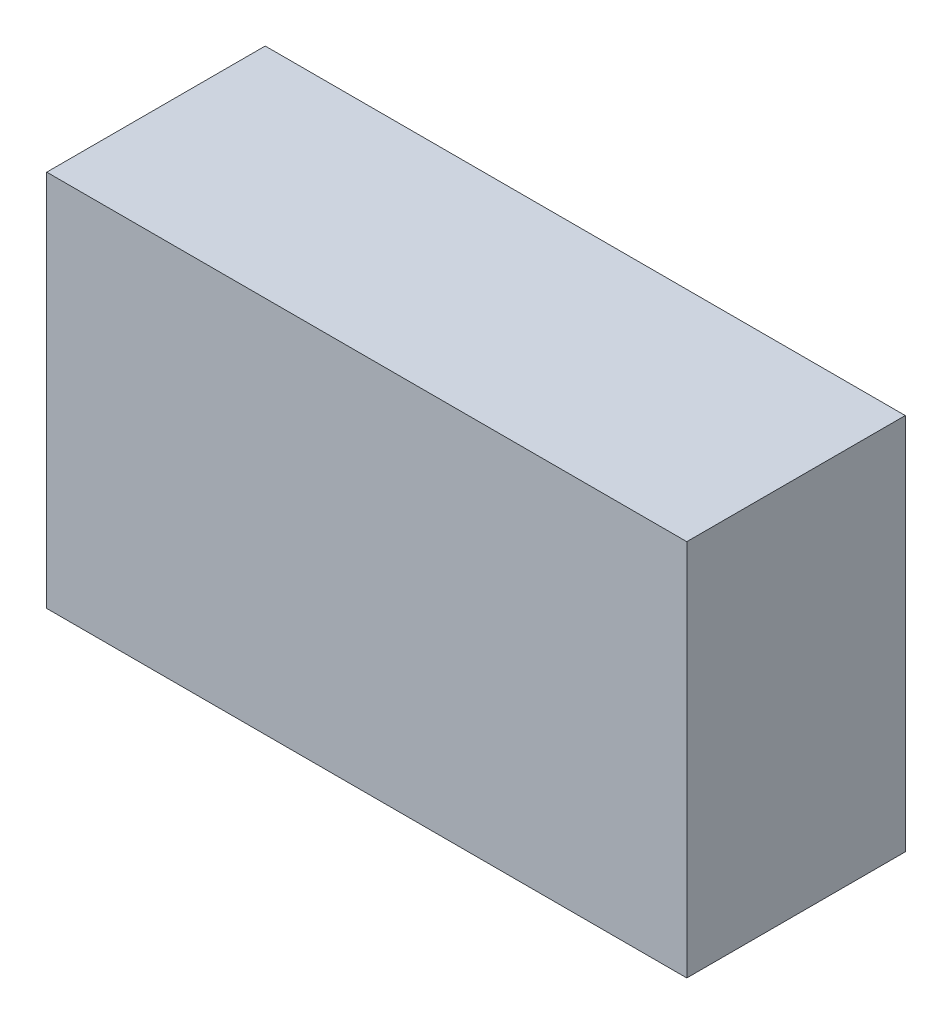
ISO-10303-21;
HEADER;
FILE_DESCRIPTION(('STEP AP214'),'2;1');
FILE_NAME('part.step','',(''),(''),'','','');
FILE_SCHEMA(('AUTOMOTIVE_DESIGN { 1 0 10303 214 1 1 1 1 }'));
ENDSEC;
DATA;
#1=APPLICATION_CONTEXT('core data for automotive mechanical design processes');
#2=APPLICATION_PROTOCOL_DEFINITION('international standard','automotive_design',2000,#1);
#3=PRODUCT_CONTEXT('',#1,'mechanical');
#4=PRODUCT('Part','Part','',(#3));
#5=PRODUCT_RELATED_PRODUCT_CATEGORY('part','',(#4));
#6=PRODUCT_DEFINITION_FORMATION('','',#4);
#7=PRODUCT_DEFINITION_CONTEXT('part definition',#1,'design');
#8=PRODUCT_DEFINITION('design','',#6,#7);
#9=PRODUCT_DEFINITION_SHAPE('','',#8);
#10=(LENGTH_UNIT() NAMED_UNIT(*) SI_UNIT(.MILLI.,.METRE.));
#11=(NAMED_UNIT(*) PLANE_ANGLE_UNIT() SI_UNIT($,.RADIAN.));
#12=(NAMED_UNIT(*) SI_UNIT($,.STERADIAN.) SOLID_ANGLE_UNIT());
#13=UNCERTAINTY_MEASURE_WITH_UNIT(LENGTH_MEASURE(1.E-05),#10,'distance_accuracy_value','');
#14=(GEOMETRIC_REPRESENTATION_CONTEXT(3) GLOBAL_UNCERTAINTY_ASSIGNED_CONTEXT((#13)) GLOBAL_UNIT_ASSIGNED_CONTEXT((#10,
#11,#12)) REPRESENTATION_CONTEXT('',''));
#15=CARTESIAN_POINT('',(0.,0.,0.));
#16=DIRECTION('',(0.,0.,1.));
#17=DIRECTION('',(1.,0.,0.));
#18=AXIS2_PLACEMENT_3D('',#15,#16,#17);
#19=CARTESIAN_POINT('',(-16.7754999999996,30.19,7.25));
#20=DIRECTION('',(1.,0.,0.));
#21=DIRECTION('',(0.,0.,-1.));
#22=AXIS2_PLACEMENT_3D('',#19,#20,#21);
#23=PLANE('',#22);
#24=DIRECTION('',(0.,-1.,0.));
#25=VECTOR('',#24,1.);
#26=CARTESIAN_POINT('',(-16.7754999999996,30.19,0.));
#27=LINE('',#26,#25);
#28=CARTESIAN_POINT('',(-16.7754999999996,30.19,0.));
#29=VERTEX_POINT('',#28);
#30=CARTESIAN_POINT('',(-16.7754999999996,17.65,0.));
#31=VERTEX_POINT('',#30);
#32=EDGE_CURVE('E128',#29,#31,#27,.T.);
#33=ORIENTED_EDGE('',*,*,#32,.T.);
#34=DIRECTION('',(0.,0.,-1.));
#35=VECTOR('',#34,1.);
#36=CARTESIAN_POINT('',(-16.7754999999996,17.65,7.25));
#37=LINE('',#36,#35);
#38=CARTESIAN_POINT('',(-16.7754999999996,17.65,7.25));
#39=VERTEX_POINT('',#38);
#40=EDGE_CURVE('E11',#39,#31,#37,.T.);
#41=ORIENTED_EDGE('',*,*,#40,.F.);
#42=DIRECTION('',(0.,-1.,0.));
#43=VECTOR('',#42,1.);
#44=CARTESIAN_POINT('',(-16.7754999999996,30.19,7.25));
#45=LINE('',#44,#43);
#46=CARTESIAN_POINT('',(-16.7754999999996,30.19,7.25));
#47=VERTEX_POINT('',#46);
#48=EDGE_CURVE('E148',#47,#39,#45,.T.);
#49=ORIENTED_EDGE('',*,*,#48,.F.);
#50=DIRECTION('',(0.,0.,-1.));
#51=VECTOR('',#50,1.);
#52=CARTESIAN_POINT('',(-16.7754999999996,30.19,7.25));
#53=LINE('',#52,#51);
#54=EDGE_CURVE('E153',#47,#29,#53,.T.);
#55=ORIENTED_EDGE('',*,*,#54,.T.);
#56=EDGE_LOOP('',(#33,#41,#49,#55));
#57=FACE_BOUND('',#56,.T.);
#58=ADVANCED_FACE('F32',(#57),#23,.F.);
#59=CARTESIAN_POINT('',(-16.7754999999996,17.65,7.25));
#60=DIRECTION('',(0.,1.,0.));
#61=DIRECTION('',(0.,0.,1.));
#62=AXIS2_PLACEMENT_3D('',#59,#60,#61);
#63=PLANE('',#62);
#64=DIRECTION('',(1.,0.,0.));
#65=VECTOR('',#64,1.);
#66=CARTESIAN_POINT('',(-16.7754999999996,17.65,0.));
#67=LINE('',#66,#65);
#68=CARTESIAN_POINT('',(4.46450000000038,17.65,0.));
#69=VERTEX_POINT('',#68);
#70=EDGE_CURVE('E132',#31,#69,#67,.T.);
#71=ORIENTED_EDGE('',*,*,#70,.T.);
#72=DIRECTION('',(0.,0.,-1.));
#73=VECTOR('',#72,1.);
#74=CARTESIAN_POINT('',(4.46450000000038,17.65,7.25));
#75=LINE('',#74,#73);
#76=CARTESIAN_POINT('',(4.46450000000038,17.65,7.25));
#77=VERTEX_POINT('',#76);
#78=EDGE_CURVE('E39',#77,#69,#75,.T.);
#79=ORIENTED_EDGE('',*,*,#78,.F.);
#80=DIRECTION('',(1.,0.,0.));
#81=VECTOR('',#80,1.);
#82=CARTESIAN_POINT('',(-16.7754999999996,17.65,7.25));
#83=LINE('',#82,#81);
#84=EDGE_CURVE('E83',#39,#77,#83,.T.);
#85=ORIENTED_EDGE('',*,*,#84,.F.);
#86=ORIENTED_EDGE('',*,*,#40,.T.);
#87=EDGE_LOOP('',(#71,#79,#85,#86));
#88=FACE_BOUND('',#87,.T.);
#89=ADVANCED_FACE('F182',(#88),#63,.F.);
#90=CARTESIAN_POINT('',(4.46450000000038,30.19,7.25));
#91=DIRECTION('',(-1.,0.,0.));
#92=DIRECTION('',(0.,0.,1.));
#93=AXIS2_PLACEMENT_3D('',#90,#91,#92);
#94=PLANE('',#93);
#95=DIRECTION('',(0.,1.,0.));
#96=VECTOR('',#95,1.);
#97=CARTESIAN_POINT('',(4.46450000000038,30.19,0.));
#98=LINE('',#97,#96);
#99=CARTESIAN_POINT('',(4.46450000000038,30.19,0.));
#100=VERTEX_POINT('',#99);
#101=EDGE_CURVE('E156',#69,#100,#98,.T.);
#102=ORIENTED_EDGE('',*,*,#101,.T.);
#103=DIRECTION('',(0.,0.,-1.));
#104=VECTOR('',#103,1.);
#105=CARTESIAN_POINT('',(4.46450000000038,30.19,7.25));
#106=LINE('',#105,#104);
#107=CARTESIAN_POINT('',(4.46450000000038,30.19,7.25));
#108=VERTEX_POINT('',#107);
#109=EDGE_CURVE('E160',#108,#100,#106,.T.);
#110=ORIENTED_EDGE('',*,*,#109,.F.);
#111=DIRECTION('',(0.,1.,0.));
#112=VECTOR('',#111,1.);
#113=CARTESIAN_POINT('',(4.46450000000038,30.19,7.25));
#114=LINE('',#113,#112);
#115=EDGE_CURVE('E151',#77,#108,#114,.T.);
#116=ORIENTED_EDGE('',*,*,#115,.F.);
#117=ORIENTED_EDGE('',*,*,#78,.T.);
#118=EDGE_LOOP('',(#102,#110,#116,#117));
#119=FACE_BOUND('',#118,.T.);
#120=ADVANCED_FACE('F165',(#119),#94,.F.);
#121=CARTESIAN_POINT('',(-16.7754999999996,30.19,7.25));
#122=DIRECTION('',(0.,-1.,0.));
#123=DIRECTION('',(0.,0.,-1.));
#124=AXIS2_PLACEMENT_3D('',#121,#122,#123);
#125=PLANE('',#124);
#126=DIRECTION('',(-1.,0.,0.));
#127=VECTOR('',#126,1.);
#128=CARTESIAN_POINT('',(-16.7754999999996,30.19,0.));
#129=LINE('',#128,#127);
#130=EDGE_CURVE('E76',#100,#29,#129,.T.);
#131=ORIENTED_EDGE('',*,*,#130,.T.);
#132=ORIENTED_EDGE('',*,*,#54,.F.);
#133=DIRECTION('',(-1.,0.,0.));
#134=VECTOR('',#133,1.);
#135=CARTESIAN_POINT('',(-16.7754999999996,30.19,7.25));
#136=LINE('',#135,#134);
#137=EDGE_CURVE('E55',#108,#47,#136,.T.);
#138=ORIENTED_EDGE('',*,*,#137,.F.);
#139=ORIENTED_EDGE('',*,*,#109,.T.);
#140=EDGE_LOOP('',(#131,#132,#138,#139));
#141=FACE_BOUND('',#140,.T.);
#142=ADVANCED_FACE('F173',(#141),#125,.F.);
#143=CARTESIAN_POINT('',(0.,0.,7.25));
#144=DIRECTION('',(0.,0.,1.));
#145=DIRECTION('',(1.,0.,0.));
#146=AXIS2_PLACEMENT_3D('',#143,#144,#145);
#147=PLANE('',#146);
#148=ORIENTED_EDGE('',*,*,#48,.T.);
#149=ORIENTED_EDGE('',*,*,#84,.T.);
#150=ORIENTED_EDGE('',*,*,#115,.T.);
#151=ORIENTED_EDGE('',*,*,#137,.T.);
#152=EDGE_LOOP('',(#148,#149,#150,#151));
#153=FACE_BOUND('',#152,.T.);
#154=ADVANCED_FACE('F175',(#153),#147,.T.);
#155=CARTESIAN_POINT('',(0.,0.,0.));
#156=DIRECTION('',(0.,0.,1.));
#157=DIRECTION('',(1.,0.,0.));
#158=AXIS2_PLACEMENT_3D('',#155,#156,#157);
#159=PLANE('',#158);
#160=DIRECTION('',(-1.,0.,0.));
#161=VECTOR('',#160,1.);
#162=CARTESIAN_POINT('',(-16.7754999999996,29.69,0.));
#163=LINE('',#162,#161);
#164=CARTESIAN_POINT('',(3.96450000000038,29.69,0.));
#165=VERTEX_POINT('',#164);
#166=CARTESIAN_POINT('',(-16.2754999999996,29.69,0.));
#167=VERTEX_POINT('',#166);
#168=EDGE_CURVE('E123',#165,#167,#163,.T.);
#169=ORIENTED_EDGE('',*,*,#168,.T.);
#170=DIRECTION('',(0.,-1.,0.));
#171=VECTOR('',#170,1.);
#172=CARTESIAN_POINT('',(-16.2754999999996,30.19,0.));
#173=LINE('',#172,#171);
#174=CARTESIAN_POINT('',(-16.2754999999996,18.15,0.));
#175=VERTEX_POINT('',#174);
#176=EDGE_CURVE('E142',#167,#175,#173,.T.);
#177=ORIENTED_EDGE('',*,*,#176,.T.);
#178=DIRECTION('',(1.,0.,0.));
#179=VECTOR('',#178,1.);
#180=CARTESIAN_POINT('',(-16.7754999999996,18.15,0.));
#181=LINE('',#180,#179);
#182=CARTESIAN_POINT('',(3.96450000000038,18.15,0.));
#183=VERTEX_POINT('',#182);
#184=EDGE_CURVE('E127',#175,#183,#181,.T.);
#185=ORIENTED_EDGE('',*,*,#184,.T.);
#186=DIRECTION('',(0.,1.,0.));
#187=VECTOR('',#186,1.);
#188=CARTESIAN_POINT('',(3.96450000000038,30.19,0.));
#189=LINE('',#188,#187);
#190=EDGE_CURVE('E46',#183,#165,#189,.T.);
#191=ORIENTED_EDGE('',*,*,#190,.T.);
#192=EDGE_LOOP('',(#169,#177,#185,#191));
#193=FACE_BOUND('',#192,.T.);
#194=ORIENTED_EDGE('',*,*,#32,.F.);
#195=ORIENTED_EDGE('',*,*,#130,.F.);
#196=ORIENTED_EDGE('',*,*,#101,.F.);
#197=ORIENTED_EDGE('',*,*,#70,.F.);
#198=EDGE_LOOP('',(#194,#195,#196,#197));
#199=FACE_BOUND('',#198,.T.);
#200=ADVANCED_FACE('F169',(#193,#199),#159,.F.);
#201=CARTESIAN_POINT('',(-16.2754999999996,30.19,7.25));
#202=DIRECTION('',(1.,0.,0.));
#203=DIRECTION('',(0.,0.,-1.));
#204=AXIS2_PLACEMENT_3D('',#201,#202,#203);
#205=PLANE('',#204);
#206=ORIENTED_EDGE('',*,*,#176,.F.);
#207=DIRECTION('',(0.,0.,-1.));
#208=VECTOR('',#207,1.);
#209=CARTESIAN_POINT('',(-16.2754999999996,29.69,7.25));
#210=LINE('',#209,#208);
#211=CARTESIAN_POINT('',(-16.2754999999996,29.69,7.05));
#212=VERTEX_POINT('',#211);
#213=EDGE_CURVE('E122',#212,#167,#210,.T.);
#214=ORIENTED_EDGE('',*,*,#213,.F.);
#215=DIRECTION('',(0.,-1.,0.));
#216=VECTOR('',#215,1.);
#217=CARTESIAN_POINT('',(-16.2754999999996,30.19,7.05));
#218=LINE('',#217,#216);
#219=CARTESIAN_POINT('',(-16.2754999999996,18.15,7.05));
#220=VERTEX_POINT('',#219);
#221=EDGE_CURVE('E110',#212,#220,#218,.T.);
#222=ORIENTED_EDGE('',*,*,#221,.T.);
#223=DIRECTION('',(0.,0.,-1.));
#224=VECTOR('',#223,1.);
#225=CARTESIAN_POINT('',(-16.2754999999996,18.15,7.25));
#226=LINE('',#225,#224);
#227=EDGE_CURVE('E120',#220,#175,#226,.T.);
#228=ORIENTED_EDGE('',*,*,#227,.T.);
#229=EDGE_LOOP('',(#206,#214,#222,#228));
#230=FACE_BOUND('',#229,.T.);
#231=ADVANCED_FACE('F119',(#230),#205,.T.);
#232=CARTESIAN_POINT('',(-16.7754999999996,18.15,7.25));
#233=DIRECTION('',(0.,1.,0.));
#234=DIRECTION('',(0.,0.,1.));
#235=AXIS2_PLACEMENT_3D('',#232,#233,#234);
#236=PLANE('',#235);
#237=ORIENTED_EDGE('',*,*,#184,.F.);
#238=ORIENTED_EDGE('',*,*,#227,.F.);
#239=DIRECTION('',(1.,0.,0.));
#240=VECTOR('',#239,1.);
#241=CARTESIAN_POINT('',(-16.7754999999996,18.15,7.05));
#242=LINE('',#241,#240);
#243=CARTESIAN_POINT('',(3.96450000000038,18.15,7.05));
#244=VERTEX_POINT('',#243);
#245=EDGE_CURVE('E106',#220,#244,#242,.T.);
#246=ORIENTED_EDGE('',*,*,#245,.T.);
#247=DIRECTION('',(0.,0.,-1.));
#248=VECTOR('',#247,1.);
#249=CARTESIAN_POINT('',(3.96450000000038,18.15,7.25));
#250=LINE('',#249,#248);
#251=EDGE_CURVE('E129',#244,#183,#250,.T.);
#252=ORIENTED_EDGE('',*,*,#251,.T.);
#253=EDGE_LOOP('',(#237,#238,#246,#252));
#254=FACE_BOUND('',#253,.T.);
#255=ADVANCED_FACE('F125',(#254),#236,.T.);
#256=CARTESIAN_POINT('',(3.96450000000038,30.19,7.25));
#257=DIRECTION('',(-1.,0.,0.));
#258=DIRECTION('',(0.,0.,1.));
#259=AXIS2_PLACEMENT_3D('',#256,#257,#258);
#260=PLANE('',#259);
#261=ORIENTED_EDGE('',*,*,#190,.F.);
#262=ORIENTED_EDGE('',*,*,#251,.F.);
#263=DIRECTION('',(0.,1.,0.));
#264=VECTOR('',#263,1.);
#265=CARTESIAN_POINT('',(3.96450000000038,30.19,7.05));
#266=LINE('',#265,#264);
#267=CARTESIAN_POINT('',(3.96450000000038,29.69,7.05));
#268=VERTEX_POINT('',#267);
#269=EDGE_CURVE('E111',#244,#268,#266,.T.);
#270=ORIENTED_EDGE('',*,*,#269,.T.);
#271=DIRECTION('',(0.,0.,-1.));
#272=VECTOR('',#271,1.);
#273=CARTESIAN_POINT('',(3.96450000000037,29.69,7.25));
#274=LINE('',#273,#272);
#275=EDGE_CURVE('E134',#268,#165,#274,.T.);
#276=ORIENTED_EDGE('',*,*,#275,.T.);
#277=EDGE_LOOP('',(#261,#262,#270,#276));
#278=FACE_BOUND('',#277,.T.);
#279=ADVANCED_FACE('F230',(#278),#260,.T.);
#280=CARTESIAN_POINT('',(-16.7754999999996,29.69,7.25));
#281=DIRECTION('',(0.,-1.,0.));
#282=DIRECTION('',(0.,0.,-1.));
#283=AXIS2_PLACEMENT_3D('',#280,#281,#282);
#284=PLANE('',#283);
#285=ORIENTED_EDGE('',*,*,#168,.F.);
#286=ORIENTED_EDGE('',*,*,#275,.F.);
#287=DIRECTION('',(-1.,0.,0.));
#288=VECTOR('',#287,1.);
#289=CARTESIAN_POINT('',(-16.7754999999996,29.69,7.05));
#290=LINE('',#289,#288);
#291=EDGE_CURVE('E137',#268,#212,#290,.T.);
#292=ORIENTED_EDGE('',*,*,#291,.T.);
#293=ORIENTED_EDGE('',*,*,#213,.T.);
#294=EDGE_LOOP('',(#285,#286,#292,#293));
#295=FACE_BOUND('',#294,.T.);
#296=ADVANCED_FACE('F239',(#295),#284,.T.);
#297=CARTESIAN_POINT('',(0.,0.,7.05));
#298=DIRECTION('',(0.,0.,1.));
#299=DIRECTION('',(1.,0.,0.));
#300=AXIS2_PLACEMENT_3D('',#297,#298,#299);
#301=PLANE('',#300);
#302=ORIENTED_EDGE('',*,*,#221,.F.);
#303=ORIENTED_EDGE('',*,*,#291,.F.);
#304=ORIENTED_EDGE('',*,*,#269,.F.);
#305=ORIENTED_EDGE('',*,*,#245,.F.);
#306=EDGE_LOOP('',(#302,#303,#304,#305));
#307=FACE_BOUND('',#306,.T.);
#308=ADVANCED_FACE('F108',(#307),#301,.F.);
#309=CLOSED_SHELL('',(#58,#89,#120,#142,#154,#200,#231,#255,#279,#296,#308));
#310=MANIFOLD_SOLID_BREP('B2',#309);
#311=ADVANCED_BREP_SHAPE_REPRESENTATION('',(#18,#310),#14);
#312=SHAPE_DEFINITION_REPRESENTATION(#9,#311);
ENDSEC;
END-ISO-10303-21;
